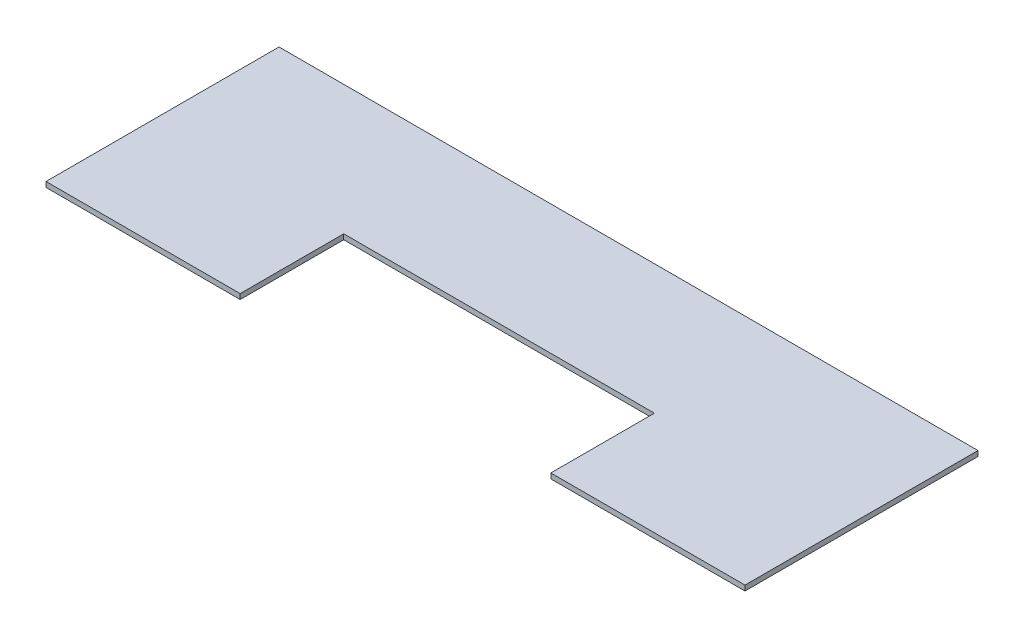
ISO-10303-21;
HEADER;
FILE_DESCRIPTION(('STEP AP214'),'2;1');
FILE_NAME('part.step','',(''),(''),'','','');
FILE_SCHEMA(('AUTOMOTIVE_DESIGN { 1 0 10303 214 1 1 1 1 }'));
ENDSEC;
DATA;
#1=APPLICATION_CONTEXT('core data for automotive mechanical design processes');
#2=APPLICATION_PROTOCOL_DEFINITION('international standard','automotive_design',2000,#1);
#3=PRODUCT_CONTEXT('',#1,'mechanical');
#4=PRODUCT('Part','Part','',(#3));
#5=PRODUCT_RELATED_PRODUCT_CATEGORY('part','',(#4));
#6=PRODUCT_DEFINITION_FORMATION('','',#4);
#7=PRODUCT_DEFINITION_CONTEXT('part definition',#1,'design');
#8=PRODUCT_DEFINITION('design','',#6,#7);
#9=PRODUCT_DEFINITION_SHAPE('','',#8);
#10=(LENGTH_UNIT() NAMED_UNIT(*) SI_UNIT(.MILLI.,.METRE.));
#11=(NAMED_UNIT(*) PLANE_ANGLE_UNIT() SI_UNIT($,.RADIAN.));
#12=(NAMED_UNIT(*) SI_UNIT($,.STERADIAN.) SOLID_ANGLE_UNIT());
#13=UNCERTAINTY_MEASURE_WITH_UNIT(LENGTH_MEASURE(1.E-05),#10,'distance_accuracy_value','');
#14=(GEOMETRIC_REPRESENTATION_CONTEXT(3) GLOBAL_UNCERTAINTY_ASSIGNED_CONTEXT((#13)) GLOBAL_UNIT_ASSIGNED_CONTEXT((#10,
#11,#12)) REPRESENTATION_CONTEXT('',''));
#15=CARTESIAN_POINT('',(0.,0.,0.));
#16=DIRECTION('',(0.,0.,1.));
#17=DIRECTION('',(1.,0.,0.));
#18=AXIS2_PLACEMENT_3D('',#15,#16,#17);
#19=CARTESIAN_POINT('',(30.,1.,0.));
#20=DIRECTION('',(-1.,0.,0.));
#21=DIRECTION('',(0.,0.,1.));
#22=AXIS2_PLACEMENT_3D('',#19,#20,#21);
#23=PLANE('',#22);
#24=DIRECTION('',(0.,0.,-1.));
#25=VECTOR('',#24,1.);
#26=CARTESIAN_POINT('',(30.,0.,0.));
#27=LINE('',#26,#25);
#28=CARTESIAN_POINT('',(30.,0.,22.5));
#29=VERTEX_POINT('',#28);
#30=CARTESIAN_POINT('',(30.,0.,2.5));
#31=VERTEX_POINT('',#30);
#32=EDGE_CURVE('E134',#29,#31,#27,.T.);
#33=ORIENTED_EDGE('',*,*,#32,.F.);
#34=DIRECTION('',(0.,-1.,0.));
#35=VECTOR('',#34,1.);
#36=CARTESIAN_POINT('',(30.,1.,22.5));
#37=LINE('',#36,#35);
#38=CARTESIAN_POINT('',(30.,1.,22.5));
#39=VERTEX_POINT('',#38);
#40=EDGE_CURVE('E11',#39,#29,#37,.T.);
#41=ORIENTED_EDGE('',*,*,#40,.F.);
#42=DIRECTION('',(0.,0.,-1.));
#43=VECTOR('',#42,1.);
#44=CARTESIAN_POINT('',(30.,1.,0.));
#45=LINE('',#44,#43);
#46=CARTESIAN_POINT('',(30.,1.,2.5));
#47=VERTEX_POINT('',#46);
#48=EDGE_CURVE('E151',#39,#47,#45,.T.);
#49=ORIENTED_EDGE('',*,*,#48,.T.);
#50=DIRECTION('',(0.,-1.,0.));
#51=VECTOR('',#50,1.);
#52=CARTESIAN_POINT('',(30.,1.,2.5));
#53=LINE('',#52,#51);
#54=EDGE_CURVE('E89',#47,#31,#53,.T.);
#55=ORIENTED_EDGE('',*,*,#54,.T.);
#56=EDGE_LOOP('',(#33,#41,#49,#55));
#57=FACE_BOUND('',#56,.T.);
#58=ADVANCED_FACE('F38',(#57),#23,.T.);
#59=CARTESIAN_POINT('',(0.,1.,22.5));
#60=DIRECTION('',(0.,0.,-1.));
#61=DIRECTION('',(-1.,0.,0.));
#62=AXIS2_PLACEMENT_3D('',#59,#60,#61);
#63=PLANE('',#62);
#64=DIRECTION('',(1.,0.,0.));
#65=VECTOR('',#64,1.);
#66=CARTESIAN_POINT('',(0.,0.,22.5));
#67=LINE('',#66,#65);
#68=CARTESIAN_POINT('',(67.5,0.,22.5));
#69=VERTEX_POINT('',#68);
#70=EDGE_CURVE('E137',#29,#69,#67,.T.);
#71=ORIENTED_EDGE('',*,*,#70,.T.);
#72=DIRECTION('',(0.,-1.,0.));
#73=VECTOR('',#72,1.);
#74=CARTESIAN_POINT('',(67.5,1.,22.5));
#75=LINE('',#74,#73);
#76=CARTESIAN_POINT('',(67.5,1.,22.5));
#77=VERTEX_POINT('',#76);
#78=EDGE_CURVE('E46',#77,#69,#75,.T.);
#79=ORIENTED_EDGE('',*,*,#78,.F.);
#80=DIRECTION('',(1.,0.,0.));
#81=VECTOR('',#80,1.);
#82=CARTESIAN_POINT('',(0.,1.,22.5));
#83=LINE('',#82,#81);
#84=EDGE_CURVE('E120',#39,#77,#83,.T.);
#85=ORIENTED_EDGE('',*,*,#84,.F.);
#86=ORIENTED_EDGE('',*,*,#40,.T.);
#87=EDGE_LOOP('',(#71,#79,#85,#86));
#88=FACE_BOUND('',#87,.T.);
#89=ADVANCED_FACE('F167',(#88),#63,.F.);
#90=CARTESIAN_POINT('',(67.5,1.,0.));
#91=DIRECTION('',(1.,0.,0.));
#92=DIRECTION('',(0.,0.,-1.));
#93=AXIS2_PLACEMENT_3D('',#90,#91,#92);
#94=PLANE('',#93);
#95=DIRECTION('',(0.,0.,1.));
#96=VECTOR('',#95,1.);
#97=CARTESIAN_POINT('',(67.5,0.,0.));
#98=LINE('',#97,#96);
#99=CARTESIAN_POINT('',(67.5,0.,-22.5));
#100=VERTEX_POINT('',#99);
#101=EDGE_CURVE('E140',#100,#69,#98,.T.);
#102=ORIENTED_EDGE('',*,*,#101,.F.);
#103=DIRECTION('',(0.,-1.,0.));
#104=VECTOR('',#103,1.);
#105=CARTESIAN_POINT('',(67.5,1.,-22.5));
#106=LINE('',#105,#104);
#107=CARTESIAN_POINT('',(67.5,1.,-22.5));
#108=VERTEX_POINT('',#107);
#109=EDGE_CURVE('E157',#108,#100,#106,.T.);
#110=ORIENTED_EDGE('',*,*,#109,.F.);
#111=DIRECTION('',(0.,0.,1.));
#112=VECTOR('',#111,1.);
#113=CARTESIAN_POINT('',(67.5,1.,0.));
#114=LINE('',#113,#112);
#115=EDGE_CURVE('E164',#108,#77,#114,.T.);
#116=ORIENTED_EDGE('',*,*,#115,.T.);
#117=ORIENTED_EDGE('',*,*,#78,.T.);
#118=EDGE_LOOP('',(#102,#110,#116,#117));
#119=FACE_BOUND('',#118,.T.);
#120=ADVANCED_FACE('F162',(#119),#94,.T.);
#121=CARTESIAN_POINT('',(0.,1.,-22.5));
#122=DIRECTION('',(0.,0.,-1.));
#123=DIRECTION('',(-1.,0.,0.));
#124=AXIS2_PLACEMENT_3D('',#121,#122,#123);
#125=PLANE('',#124);
#126=DIRECTION('',(1.,0.,0.));
#127=VECTOR('',#126,1.);
#128=CARTESIAN_POINT('',(0.,0.,-22.5));
#129=LINE('',#128,#127);
#130=CARTESIAN_POINT('',(-67.5,0.,-22.5));
#131=VERTEX_POINT('',#130);
#132=EDGE_CURVE('E143',#131,#100,#129,.T.);
#133=ORIENTED_EDGE('',*,*,#132,.F.);
#134=DIRECTION('',(0.,-1.,0.));
#135=VECTOR('',#134,1.);
#136=CARTESIAN_POINT('',(-67.5,1.,-22.5));
#137=LINE('',#136,#135);
#138=CARTESIAN_POINT('',(-67.5,1.,-22.5));
#139=VERTEX_POINT('',#138);
#140=EDGE_CURVE('E155',#139,#131,#137,.T.);
#141=ORIENTED_EDGE('',*,*,#140,.F.);
#142=DIRECTION('',(1.,0.,0.));
#143=VECTOR('',#142,1.);
#144=CARTESIAN_POINT('',(0.,1.,-22.5));
#145=LINE('',#144,#143);
#146=EDGE_CURVE('E175',#139,#108,#145,.T.);
#147=ORIENTED_EDGE('',*,*,#146,.T.);
#148=ORIENTED_EDGE('',*,*,#109,.T.);
#149=EDGE_LOOP('',(#133,#141,#147,#148));
#150=FACE_BOUND('',#149,.T.);
#151=ADVANCED_FACE('F173',(#150),#125,.T.);
#152=CARTESIAN_POINT('',(-67.5,1.,0.));
#153=DIRECTION('',(1.,0.,0.));
#154=DIRECTION('',(0.,0.,-1.));
#155=AXIS2_PLACEMENT_3D('',#152,#153,#154);
#156=PLANE('',#155);
#157=DIRECTION('',(0.,0.,1.));
#158=VECTOR('',#157,1.);
#159=CARTESIAN_POINT('',(-67.5,0.,0.));
#160=LINE('',#159,#158);
#161=CARTESIAN_POINT('',(-67.5,0.,22.5));
#162=VERTEX_POINT('',#161);
#163=EDGE_CURVE('E146',#131,#162,#160,.T.);
#164=ORIENTED_EDGE('',*,*,#163,.T.);
#165=DIRECTION('',(0.,-1.,0.));
#166=VECTOR('',#165,1.);
#167=CARTESIAN_POINT('',(-67.5,1.,22.5));
#168=LINE('',#167,#166);
#169=CARTESIAN_POINT('',(-67.5,1.,22.5));
#170=VERTEX_POINT('',#169);
#171=EDGE_CURVE('E125',#170,#162,#168,.T.);
#172=ORIENTED_EDGE('',*,*,#171,.F.);
#173=DIRECTION('',(0.,0.,1.));
#174=VECTOR('',#173,1.);
#175=CARTESIAN_POINT('',(-67.5,1.,0.));
#176=LINE('',#175,#174);
#177=EDGE_CURVE('E115',#139,#170,#176,.T.);
#178=ORIENTED_EDGE('',*,*,#177,.F.);
#179=ORIENTED_EDGE('',*,*,#140,.T.);
#180=EDGE_LOOP('',(#164,#172,#178,#179));
#181=FACE_BOUND('',#180,.T.);
#182=ADVANCED_FACE('F189',(#181),#156,.F.);
#183=CARTESIAN_POINT('',(-30.,0.,22.5));
#184=VERTEX_POINT('',#183);
#185=EDGE_CURVE('E124',#162,#184,#67,.T.);
#186=ORIENTED_EDGE('',*,*,#185,.T.);
#187=DIRECTION('',(0.,-1.,0.));
#188=VECTOR('',#187,1.);
#189=CARTESIAN_POINT('',(-30.,1.,22.5));
#190=LINE('',#189,#188);
#191=CARTESIAN_POINT('',(-30.,1.,22.5));
#192=VERTEX_POINT('',#191);
#193=EDGE_CURVE('E121',#192,#184,#190,.T.);
#194=ORIENTED_EDGE('',*,*,#193,.F.);
#195=EDGE_CURVE('E108',#170,#192,#83,.T.);
#196=ORIENTED_EDGE('',*,*,#195,.F.);
#197=ORIENTED_EDGE('',*,*,#171,.T.);
#198=EDGE_LOOP('',(#186,#194,#196,#197));
#199=FACE_BOUND('',#198,.T.);
#200=ADVANCED_FACE('F122',(#199),#63,.F.);
#201=CARTESIAN_POINT('',(-30.,1.,0.));
#202=DIRECTION('',(-1.,0.,0.));
#203=DIRECTION('',(0.,0.,1.));
#204=AXIS2_PLACEMENT_3D('',#201,#202,#203);
#205=PLANE('',#204);
#206=DIRECTION('',(0.,0.,-1.));
#207=VECTOR('',#206,1.);
#208=CARTESIAN_POINT('',(-30.,0.,0.));
#209=LINE('',#208,#207);
#210=CARTESIAN_POINT('',(-30.,0.,2.5));
#211=VERTEX_POINT('',#210);
#212=EDGE_CURVE('E82',#184,#211,#209,.T.);
#213=ORIENTED_EDGE('',*,*,#212,.T.);
#214=DIRECTION('',(0.,-1.,0.));
#215=VECTOR('',#214,1.);
#216=CARTESIAN_POINT('',(-30.,1.,2.5));
#217=LINE('',#216,#215);
#218=CARTESIAN_POINT('',(-30.,1.,2.5));
#219=VERTEX_POINT('',#218);
#220=EDGE_CURVE('E126',#219,#211,#217,.T.);
#221=ORIENTED_EDGE('',*,*,#220,.F.);
#222=DIRECTION('',(0.,0.,-1.));
#223=VECTOR('',#222,1.);
#224=CARTESIAN_POINT('',(-30.,1.,0.));
#225=LINE('',#224,#223);
#226=EDGE_CURVE('E112',#192,#219,#225,.T.);
#227=ORIENTED_EDGE('',*,*,#226,.F.);
#228=ORIENTED_EDGE('',*,*,#193,.T.);
#229=EDGE_LOOP('',(#213,#221,#227,#228));
#230=FACE_BOUND('',#229,.T.);
#231=ADVANCED_FACE('F128',(#230),#205,.F.);
#232=CARTESIAN_POINT('',(0.,1.,2.5));
#233=DIRECTION('',(0.,0.,-1.));
#234=DIRECTION('',(-1.,0.,0.));
#235=AXIS2_PLACEMENT_3D('',#232,#233,#234);
#236=PLANE('',#235);
#237=DIRECTION('',(1.,0.,0.));
#238=VECTOR('',#237,1.);
#239=CARTESIAN_POINT('',(0.,0.,2.5));
#240=LINE('',#239,#238);
#241=EDGE_CURVE('E149',#211,#31,#240,.T.);
#242=ORIENTED_EDGE('',*,*,#241,.T.);
#243=ORIENTED_EDGE('',*,*,#54,.F.);
#244=DIRECTION('',(1.,0.,0.));
#245=VECTOR('',#244,1.);
#246=CARTESIAN_POINT('',(0.,1.,2.5));
#247=LINE('',#246,#245);
#248=EDGE_CURVE('E54',#219,#47,#247,.T.);
#249=ORIENTED_EDGE('',*,*,#248,.F.);
#250=ORIENTED_EDGE('',*,*,#220,.T.);
#251=EDGE_LOOP('',(#242,#243,#249,#250));
#252=FACE_BOUND('',#251,.T.);
#253=ADVANCED_FACE('F194',(#252),#236,.F.);
#254=CARTESIAN_POINT('',(0.,1.,0.));
#255=DIRECTION('',(0.,1.,0.));
#256=DIRECTION('',(0.,0.,1.));
#257=AXIS2_PLACEMENT_3D('',#254,#255,#256);
#258=PLANE('',#257);
#259=ORIENTED_EDGE('',*,*,#48,.F.);
#260=ORIENTED_EDGE('',*,*,#84,.T.);
#261=ORIENTED_EDGE('',*,*,#115,.F.);
#262=ORIENTED_EDGE('',*,*,#146,.F.);
#263=ORIENTED_EDGE('',*,*,#177,.T.);
#264=ORIENTED_EDGE('',*,*,#195,.T.);
#265=ORIENTED_EDGE('',*,*,#226,.T.);
#266=ORIENTED_EDGE('',*,*,#248,.T.);
#267=EDGE_LOOP('',(#259,#260,#261,#262,#263,#264,#265,#266));
#268=FACE_BOUND('',#267,.T.);
#269=ADVANCED_FACE('F110',(#268),#258,.T.);
#270=CARTESIAN_POINT('',(0.,0.,0.));
#271=DIRECTION('',(0.,1.,0.));
#272=DIRECTION('',(0.,0.,1.));
#273=AXIS2_PLACEMENT_3D('',#270,#271,#272);
#274=PLANE('',#273);
#275=ORIENTED_EDGE('',*,*,#32,.T.);
#276=ORIENTED_EDGE('',*,*,#241,.F.);
#277=ORIENTED_EDGE('',*,*,#212,.F.);
#278=ORIENTED_EDGE('',*,*,#185,.F.);
#279=ORIENTED_EDGE('',*,*,#163,.F.);
#280=ORIENTED_EDGE('',*,*,#132,.T.);
#281=ORIENTED_EDGE('',*,*,#101,.T.);
#282=ORIENTED_EDGE('',*,*,#70,.F.);
#283=EDGE_LOOP('',(#275,#276,#277,#278,#279,#280,#281,#282));
#284=FACE_BOUND('',#283,.T.);
#285=ADVANCED_FACE('F169',(#284),#274,.F.);
#286=CLOSED_SHELL('',(#58,#89,#120,#151,#182,#200,#231,#253,#269,#285));
#287=MANIFOLD_SOLID_BREP('B2',#286);
#288=ADVANCED_BREP_SHAPE_REPRESENTATION('',(#18,#287),#14);
#289=SHAPE_DEFINITION_REPRESENTATION(#9,#288);
ENDSEC;
END-ISO-10303-21;
